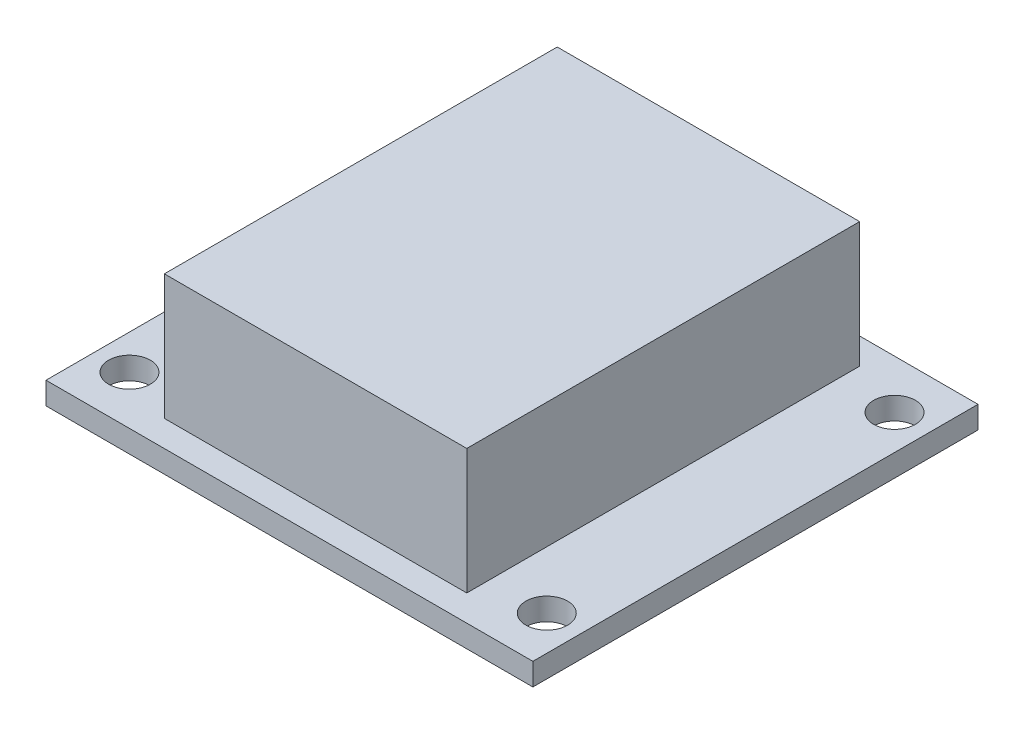
ISO-10303-21;
HEADER;
FILE_DESCRIPTION(('STEP AP214'),'2;1');
FILE_NAME('part.step','',(''),(''),'','','');
FILE_SCHEMA(('AUTOMOTIVE_DESIGN { 1 0 10303 214 1 1 1 1 }'));
ENDSEC;
DATA;
#1=APPLICATION_CONTEXT('core data for automotive mechanical design processes');
#2=APPLICATION_PROTOCOL_DEFINITION('international standard','automotive_design',2000,#1);
#3=PRODUCT_CONTEXT('',#1,'mechanical');
#4=PRODUCT('Part','Part','',(#3));
#5=PRODUCT_RELATED_PRODUCT_CATEGORY('part','',(#4));
#6=PRODUCT_DEFINITION_FORMATION('','',#4);
#7=PRODUCT_DEFINITION_CONTEXT('part definition',#1,'design');
#8=PRODUCT_DEFINITION('design','',#6,#7);
#9=PRODUCT_DEFINITION_SHAPE('','',#8);
#10=(LENGTH_UNIT() NAMED_UNIT(*) SI_UNIT(.MILLI.,.METRE.));
#11=(NAMED_UNIT(*) PLANE_ANGLE_UNIT() SI_UNIT($,.RADIAN.));
#12=(NAMED_UNIT(*) SI_UNIT($,.STERADIAN.) SOLID_ANGLE_UNIT());
#13=UNCERTAINTY_MEASURE_WITH_UNIT(LENGTH_MEASURE(1.E-05),#10,'distance_accuracy_value','');
#14=(GEOMETRIC_REPRESENTATION_CONTEXT(3) GLOBAL_UNCERTAINTY_ASSIGNED_CONTEXT((#13)) GLOBAL_UNIT_ASSIGNED_CONTEXT((#10,
#11,#12)) REPRESENTATION_CONTEXT('',''));
#15=CARTESIAN_POINT('',(0.,0.,0.));
#16=DIRECTION('',(0.,0.,1.));
#17=DIRECTION('',(1.,0.,0.));
#18=AXIS2_PLACEMENT_3D('',#15,#16,#17);
#19=CARTESIAN_POINT('',(0.,1.6,0.));
#20=DIRECTION('',(0.,-1.,0.));
#21=DIRECTION('',(0.,0.,-1.));
#22=AXIS2_PLACEMENT_3D('',#19,#20,#21);
#23=PLANE('',#22);
#24=CARTESIAN_POINT('',(-15.,1.6,12.5));
#25=DIRECTION('',(0.,1.,0.));
#26=DIRECTION('',(0.,0.,-1.));
#27=AXIS2_PLACEMENT_3D('',#24,#25,#26);
#28=CIRCLE('',#27,1.5);
#29=CARTESIAN_POINT('',(-15.,1.6,11.));
#30=VERTEX_POINT('',#29);
#31=EDGE_CURVE('E122',#30,#30,#28,.T.);
#32=ORIENTED_EDGE('',*,*,#31,.F.);
#33=EDGE_LOOP('',(#32));
#34=FACE_BOUND('',#33,.T.);
#35=CARTESIAN_POINT('',(15.,1.6,-12.5));
#36=DIRECTION('',(0.,1.,0.));
#37=DIRECTION('',(0.,0.,-1.));
#38=AXIS2_PLACEMENT_3D('',#35,#36,#37);
#39=CIRCLE('',#38,1.5);
#40=CARTESIAN_POINT('',(15.,1.6,-14.));
#41=VERTEX_POINT('',#40);
#42=EDGE_CURVE('E137',#41,#41,#39,.T.);
#43=ORIENTED_EDGE('',*,*,#42,.F.);
#44=EDGE_LOOP('',(#43));
#45=FACE_BOUND('',#44,.T.);
#46=DIRECTION('',(0.,0.,-1.));
#47=VECTOR('',#46,1.);
#48=CARTESIAN_POINT('',(17.5,1.6,16.));
#49=LINE('',#48,#47);
#50=CARTESIAN_POINT('',(17.5,1.6,16.));
#51=VERTEX_POINT('',#50);
#52=CARTESIAN_POINT('',(17.5,1.6,-16.));
#53=VERTEX_POINT('',#52);
#54=EDGE_CURVE('E149',#51,#53,#49,.T.);
#55=ORIENTED_EDGE('',*,*,#54,.T.);
#56=DIRECTION('',(-1.,0.,0.));
#57=VECTOR('',#56,1.);
#58=CARTESIAN_POINT('',(-17.5,1.6,-16.));
#59=LINE('',#58,#57);
#60=CARTESIAN_POINT('',(-17.5,1.6,-16.));
#61=VERTEX_POINT('',#60);
#62=EDGE_CURVE('E152',#53,#61,#59,.T.);
#63=ORIENTED_EDGE('',*,*,#62,.T.);
#64=DIRECTION('',(0.,0.,1.));
#65=VECTOR('',#64,1.);
#66=CARTESIAN_POINT('',(-17.5,1.6,16.));
#67=LINE('',#66,#65);
#68=CARTESIAN_POINT('',(-17.5,1.6,16.));
#69=VERTEX_POINT('',#68);
#70=EDGE_CURVE('E155',#61,#69,#67,.T.);
#71=ORIENTED_EDGE('',*,*,#70,.T.);
#72=DIRECTION('',(1.,0.,0.));
#73=VECTOR('',#72,1.);
#74=CARTESIAN_POINT('',(-17.5,1.6,16.));
#75=LINE('',#74,#73);
#76=EDGE_CURVE('E157',#69,#51,#75,.T.);
#77=ORIENTED_EDGE('',*,*,#76,.T.);
#78=EDGE_LOOP('',(#55,#63,#71,#77));
#79=FACE_BOUND('',#78,.T.);
#80=CARTESIAN_POINT('',(-15.,1.6,-12.5));
#81=DIRECTION('',(0.,1.,0.));
#82=DIRECTION('',(0.,0.,1.));
#83=AXIS2_PLACEMENT_3D('',#80,#81,#82);
#84=CIRCLE('',#83,1.5);
#85=CARTESIAN_POINT('',(-15.,1.6,-11.));
#86=VERTEX_POINT('',#85);
#87=EDGE_CURVE('E143',#86,#86,#84,.T.);
#88=ORIENTED_EDGE('',*,*,#87,.F.);
#89=EDGE_LOOP('',(#88));
#90=FACE_BOUND('',#89,.T.);
#91=CARTESIAN_POINT('',(15.,1.6,12.5));
#92=DIRECTION('',(0.,1.,0.));
#93=DIRECTION('',(0.,0.,1.));
#94=AXIS2_PLACEMENT_3D('',#91,#92,#93);
#95=CIRCLE('',#94,1.5);
#96=CARTESIAN_POINT('',(15.,1.6,14.));
#97=VERTEX_POINT('',#96);
#98=EDGE_CURVE('E131',#97,#97,#95,.T.);
#99=ORIENTED_EDGE('',*,*,#98,.F.);
#100=EDGE_LOOP('',(#99));
#101=FACE_BOUND('',#100,.T.);
#102=DIRECTION('',(0.,0.,-1.));
#103=VECTOR('',#102,1.);
#104=CARTESIAN_POINT('',(10.8703788030198,1.6,14.12185100952));
#105=LINE('',#104,#103);
#106=CARTESIAN_POINT('',(10.8703788030198,1.6,14.12185100952));
#107=VERTEX_POINT('',#106);
#108=CARTESIAN_POINT('',(10.8703788030198,1.6,-14.12185100952));
#109=VERTEX_POINT('',#108);
#110=EDGE_CURVE('E118',#107,#109,#105,.T.);
#111=ORIENTED_EDGE('',*,*,#110,.F.);
#112=DIRECTION('',(1.,0.,0.));
#113=VECTOR('',#112,1.);
#114=CARTESIAN_POINT('',(-10.8703788030198,1.6,14.12185100952));
#115=LINE('',#114,#113);
#116=CARTESIAN_POINT('',(-10.8703788030198,1.6,14.12185100952));
#117=VERTEX_POINT('',#116);
#118=EDGE_CURVE('E115',#117,#107,#115,.T.);
#119=ORIENTED_EDGE('',*,*,#118,.F.);
#120=DIRECTION('',(0.,0.,1.));
#121=VECTOR('',#120,1.);
#122=CARTESIAN_POINT('',(-10.8703788030198,1.6,14.12185100952));
#123=LINE('',#122,#121);
#124=CARTESIAN_POINT('',(-10.8703788030198,1.6,-14.12185100952));
#125=VERTEX_POINT('',#124);
#126=EDGE_CURVE('E53',#125,#117,#123,.T.);
#127=ORIENTED_EDGE('',*,*,#126,.F.);
#128=DIRECTION('',(-1.,0.,0.));
#129=VECTOR('',#128,1.);
#130=CARTESIAN_POINT('',(-10.8703788030198,1.6,-14.12185100952));
#131=LINE('',#130,#129);
#132=EDGE_CURVE('E48',#109,#125,#131,.T.);
#133=ORIENTED_EDGE('',*,*,#132,.F.);
#134=EDGE_LOOP('',(#111,#119,#127,#133));
#135=FACE_BOUND('',#134,.T.);
#136=ADVANCED_FACE('F33',(#34,#45,#79,#90,#101,#135),#23,.F.);
#137=CARTESIAN_POINT('',(0.,0.,0.));
#138=DIRECTION('',(0.,-1.,0.));
#139=DIRECTION('',(0.,0.,-1.));
#140=AXIS2_PLACEMENT_3D('',#137,#138,#139);
#141=PLANE('',#140);
#142=CARTESIAN_POINT('',(15.,0.,12.5));
#143=DIRECTION('',(0.,1.,0.));
#144=DIRECTION('',(0.,0.,1.));
#145=AXIS2_PLACEMENT_3D('',#142,#143,#144);
#146=CIRCLE('',#145,1.5);
#147=CARTESIAN_POINT('',(15.,0.,14.));
#148=VERTEX_POINT('',#147);
#149=EDGE_CURVE('E129',#148,#148,#146,.T.);
#150=ORIENTED_EDGE('',*,*,#149,.T.);
#151=EDGE_LOOP('',(#150));
#152=FACE_BOUND('',#151,.T.);
#153=CARTESIAN_POINT('',(-15.,0.,-12.5));
#154=DIRECTION('',(0.,1.,0.));
#155=DIRECTION('',(0.,0.,1.));
#156=AXIS2_PLACEMENT_3D('',#153,#154,#155);
#157=CIRCLE('',#156,1.5);
#158=CARTESIAN_POINT('',(-15.,0.,-11.));
#159=VERTEX_POINT('',#158);
#160=EDGE_CURVE('E140',#159,#159,#157,.T.);
#161=ORIENTED_EDGE('',*,*,#160,.T.);
#162=EDGE_LOOP('',(#161));
#163=FACE_BOUND('',#162,.T.);
#164=DIRECTION('',(0.,0.,-1.));
#165=VECTOR('',#164,1.);
#166=CARTESIAN_POINT('',(17.5,0.,16.));
#167=LINE('',#166,#165);
#168=CARTESIAN_POINT('',(17.5,0.,16.));
#169=VERTEX_POINT('',#168);
#170=CARTESIAN_POINT('',(17.5,0.,-16.));
#171=VERTEX_POINT('',#170);
#172=EDGE_CURVE('E146',#169,#171,#167,.T.);
#173=ORIENTED_EDGE('',*,*,#172,.F.);
#174=DIRECTION('',(1.,0.,0.));
#175=VECTOR('',#174,1.);
#176=CARTESIAN_POINT('',(-17.5,0.,16.));
#177=LINE('',#176,#175);
#178=CARTESIAN_POINT('',(-17.5,0.,16.));
#179=VERTEX_POINT('',#178);
#180=EDGE_CURVE('E153',#179,#169,#177,.T.);
#181=ORIENTED_EDGE('',*,*,#180,.F.);
#182=DIRECTION('',(0.,0.,1.));
#183=VECTOR('',#182,1.);
#184=CARTESIAN_POINT('',(-17.5,0.,16.));
#185=LINE('',#184,#183);
#186=CARTESIAN_POINT('',(-17.5,0.,-16.));
#187=VERTEX_POINT('',#186);
#188=EDGE_CURVE('E164',#187,#179,#185,.T.);
#189=ORIENTED_EDGE('',*,*,#188,.F.);
#190=DIRECTION('',(-1.,0.,0.));
#191=VECTOR('',#190,1.);
#192=CARTESIAN_POINT('',(-17.5,0.,-16.));
#193=LINE('',#192,#191);
#194=EDGE_CURVE('E162',#171,#187,#193,.T.);
#195=ORIENTED_EDGE('',*,*,#194,.F.);
#196=EDGE_LOOP('',(#173,#181,#189,#195));
#197=FACE_BOUND('',#196,.T.);
#198=CARTESIAN_POINT('',(15.,0.,-12.5));
#199=DIRECTION('',(0.,1.,0.));
#200=DIRECTION('',(0.,0.,-1.));
#201=AXIS2_PLACEMENT_3D('',#198,#199,#200);
#202=CIRCLE('',#201,1.5);
#203=CARTESIAN_POINT('',(15.,0.,-14.));
#204=VERTEX_POINT('',#203);
#205=EDGE_CURVE('E134',#204,#204,#202,.T.);
#206=ORIENTED_EDGE('',*,*,#205,.T.);
#207=EDGE_LOOP('',(#206));
#208=FACE_BOUND('',#207,.T.);
#209=CARTESIAN_POINT('',(-15.,0.,12.5));
#210=DIRECTION('',(0.,1.,0.));
#211=DIRECTION('',(0.,0.,-1.));
#212=AXIS2_PLACEMENT_3D('',#209,#210,#211);
#213=CIRCLE('',#212,1.5);
#214=CARTESIAN_POINT('',(-15.,0.,11.));
#215=VERTEX_POINT('',#214);
#216=EDGE_CURVE('E119',#215,#215,#213,.T.);
#217=ORIENTED_EDGE('',*,*,#216,.T.);
#218=EDGE_LOOP('',(#217));
#219=FACE_BOUND('',#218,.T.);
#220=ADVANCED_FACE('F182',(#152,#163,#197,#208,#219),#141,.T.);
#221=CARTESIAN_POINT('',(17.5,1.6,16.));
#222=DIRECTION('',(-1.,0.,0.));
#223=DIRECTION('',(0.,0.,1.));
#224=AXIS2_PLACEMENT_3D('',#221,#222,#223);
#225=PLANE('',#224);
#226=ORIENTED_EDGE('',*,*,#172,.T.);
#227=DIRECTION('',(0.,-1.,0.));
#228=VECTOR('',#227,1.);
#229=CARTESIAN_POINT('',(17.5,1.6,-16.));
#230=LINE('',#229,#228);
#231=EDGE_CURVE('E11',#53,#171,#230,.T.);
#232=ORIENTED_EDGE('',*,*,#231,.F.);
#233=ORIENTED_EDGE('',*,*,#54,.F.);
#234=DIRECTION('',(0.,-1.,0.));
#235=VECTOR('',#234,1.);
#236=CARTESIAN_POINT('',(17.5,1.6,16.));
#237=LINE('',#236,#235);
#238=EDGE_CURVE('E159',#51,#169,#237,.T.);
#239=ORIENTED_EDGE('',*,*,#238,.T.);
#240=EDGE_LOOP('',(#226,#232,#233,#239));
#241=FACE_BOUND('',#240,.T.);
#242=ADVANCED_FACE('F35',(#241),#225,.F.);
#243=CARTESIAN_POINT('',(-17.5,1.6,-16.));
#244=DIRECTION('',(0.,0.,1.));
#245=DIRECTION('',(1.,0.,0.));
#246=AXIS2_PLACEMENT_3D('',#243,#244,#245);
#247=PLANE('',#246);
#248=ORIENTED_EDGE('',*,*,#194,.T.);
#249=DIRECTION('',(0.,-1.,0.));
#250=VECTOR('',#249,1.);
#251=CARTESIAN_POINT('',(-17.5,1.6,-16.));
#252=LINE('',#251,#250);
#253=EDGE_CURVE('E41',#61,#187,#252,.T.);
#254=ORIENTED_EDGE('',*,*,#253,.F.);
#255=ORIENTED_EDGE('',*,*,#62,.F.);
#256=ORIENTED_EDGE('',*,*,#231,.T.);
#257=EDGE_LOOP('',(#248,#254,#255,#256));
#258=FACE_BOUND('',#257,.T.);
#259=ADVANCED_FACE('F193',(#258),#247,.F.);
#260=CARTESIAN_POINT('',(-17.5,1.6,16.));
#261=DIRECTION('',(1.,0.,0.));
#262=DIRECTION('',(0.,0.,-1.));
#263=AXIS2_PLACEMENT_3D('',#260,#261,#262);
#264=PLANE('',#263);
#265=ORIENTED_EDGE('',*,*,#188,.T.);
#266=DIRECTION('',(0.,-1.,0.));
#267=VECTOR('',#266,1.);
#268=CARTESIAN_POINT('',(-17.5,1.6,16.));
#269=LINE('',#268,#267);
#270=EDGE_CURVE('E169',#69,#179,#269,.T.);
#271=ORIENTED_EDGE('',*,*,#270,.F.);
#272=ORIENTED_EDGE('',*,*,#70,.F.);
#273=ORIENTED_EDGE('',*,*,#253,.T.);
#274=EDGE_LOOP('',(#265,#271,#272,#273));
#275=FACE_BOUND('',#274,.T.);
#276=ADVANCED_FACE('F176',(#275),#264,.F.);
#277=CARTESIAN_POINT('',(-17.5,1.6,16.));
#278=DIRECTION('',(0.,0.,-1.));
#279=DIRECTION('',(-1.,0.,0.));
#280=AXIS2_PLACEMENT_3D('',#277,#278,#279);
#281=PLANE('',#280);
#282=ORIENTED_EDGE('',*,*,#180,.T.);
#283=ORIENTED_EDGE('',*,*,#238,.F.);
#284=ORIENTED_EDGE('',*,*,#76,.F.);
#285=ORIENTED_EDGE('',*,*,#270,.T.);
#286=EDGE_LOOP('',(#282,#283,#284,#285));
#287=FACE_BOUND('',#286,.T.);
#288=ADVANCED_FACE('F186',(#287),#281,.F.);
#289=CARTESIAN_POINT('',(-15.,1.6,-12.5));
#290=DIRECTION('',(0.,-1.,0.));
#291=DIRECTION('',(0.,0.,-1.));
#292=AXIS2_PLACEMENT_3D('',#289,#290,#291);
#293=CYLINDRICAL_SURFACE('',#292,1.5);
#294=ORIENTED_EDGE('',*,*,#87,.T.);
#295=EDGE_LOOP('',(#294));
#296=FACE_BOUND('',#295,.T.);
#297=ORIENTED_EDGE('',*,*,#160,.F.);
#298=EDGE_LOOP('',(#297));
#299=FACE_BOUND('',#298,.T.);
#300=ADVANCED_FACE('F211',(#296,#299),#293,.F.);
#301=CARTESIAN_POINT('',(15.,1.6,-12.5));
#302=DIRECTION('',(0.,-1.,0.));
#303=DIRECTION('',(0.,0.,-1.));
#304=AXIS2_PLACEMENT_3D('',#301,#302,#303);
#305=CYLINDRICAL_SURFACE('',#304,1.5);
#306=ORIENTED_EDGE('',*,*,#42,.T.);
#307=EDGE_LOOP('',(#306));
#308=FACE_BOUND('',#307,.T.);
#309=ORIENTED_EDGE('',*,*,#205,.F.);
#310=EDGE_LOOP('',(#309));
#311=FACE_BOUND('',#310,.T.);
#312=ADVANCED_FACE('F218',(#308,#311),#305,.F.);
#313=CARTESIAN_POINT('',(15.,1.6,12.5));
#314=DIRECTION('',(0.,-1.,0.));
#315=DIRECTION('',(0.,0.,-1.));
#316=AXIS2_PLACEMENT_3D('',#313,#314,#315);
#317=CYLINDRICAL_SURFACE('',#316,1.5);
#318=ORIENTED_EDGE('',*,*,#98,.T.);
#319=EDGE_LOOP('',(#318));
#320=FACE_BOUND('',#319,.T.);
#321=ORIENTED_EDGE('',*,*,#149,.F.);
#322=EDGE_LOOP('',(#321));
#323=FACE_BOUND('',#322,.T.);
#324=ADVANCED_FACE('F223',(#320,#323),#317,.F.);
#325=CARTESIAN_POINT('',(-15.,1.6,12.5));
#326=DIRECTION('',(0.,-1.,0.));
#327=DIRECTION('',(0.,0.,-1.));
#328=AXIS2_PLACEMENT_3D('',#325,#326,#327);
#329=CYLINDRICAL_SURFACE('',#328,1.5);
#330=ORIENTED_EDGE('',*,*,#31,.T.);
#331=EDGE_LOOP('',(#330));
#332=FACE_BOUND('',#331,.T.);
#333=ORIENTED_EDGE('',*,*,#216,.F.);
#334=EDGE_LOOP('',(#333));
#335=FACE_BOUND('',#334,.T.);
#336=ADVANCED_FACE('F258',(#332,#335),#329,.F.);
#337=CARTESIAN_POINT('',(10.8703788030198,10.6,14.12185100952));
#338=DIRECTION('',(-1.,0.,0.));
#339=DIRECTION('',(0.,0.,1.));
#340=AXIS2_PLACEMENT_3D('',#337,#338,#339);
#341=PLANE('',#340);
#342=ORIENTED_EDGE('',*,*,#110,.T.);
#343=DIRECTION('',(0.,-1.,0.));
#344=VECTOR('',#343,1.);
#345=CARTESIAN_POINT('',(10.8703788030198,10.6,-14.12185100952));
#346=LINE('',#345,#344);
#347=CARTESIAN_POINT('',(10.8703788030198,10.6,-14.12185100952));
#348=VERTEX_POINT('',#347);
#349=EDGE_CURVE('E99',#348,#109,#346,.T.);
#350=ORIENTED_EDGE('',*,*,#349,.F.);
#351=DIRECTION('',(0.,0.,-1.));
#352=VECTOR('',#351,1.);
#353=CARTESIAN_POINT('',(10.8703788030198,10.6,14.12185100952));
#354=LINE('',#353,#352);
#355=CARTESIAN_POINT('',(10.8703788030198,10.6,14.12185100952));
#356=VERTEX_POINT('',#355);
#357=EDGE_CURVE('E106',#356,#348,#354,.T.);
#358=ORIENTED_EDGE('',*,*,#357,.F.);
#359=DIRECTION('',(0.,-1.,0.));
#360=VECTOR('',#359,1.);
#361=CARTESIAN_POINT('',(10.8703788030198,10.6,14.12185100952));
#362=LINE('',#361,#360);
#363=EDGE_CURVE('E236',#356,#107,#362,.T.);
#364=ORIENTED_EDGE('',*,*,#363,.T.);
#365=EDGE_LOOP('',(#342,#350,#358,#364));
#366=FACE_BOUND('',#365,.T.);
#367=ADVANCED_FACE('F117',(#366),#341,.F.);
#368=CARTESIAN_POINT('',(-10.8703788030198,10.6,-14.12185100952));
#369=DIRECTION('',(0.,0.,1.));
#370=DIRECTION('',(1.,0.,0.));
#371=AXIS2_PLACEMENT_3D('',#368,#369,#370);
#372=PLANE('',#371);
#373=ORIENTED_EDGE('',*,*,#132,.T.);
#374=DIRECTION('',(0.,-1.,0.));
#375=VECTOR('',#374,1.);
#376=CARTESIAN_POINT('',(-10.8703788030198,10.6,-14.12185100952));
#377=LINE('',#376,#375);
#378=CARTESIAN_POINT('',(-10.8703788030198,10.6,-14.12185100952));
#379=VERTEX_POINT('',#378);
#380=EDGE_CURVE('E102',#379,#125,#377,.T.);
#381=ORIENTED_EDGE('',*,*,#380,.F.);
#382=DIRECTION('',(-1.,0.,0.));
#383=VECTOR('',#382,1.);
#384=CARTESIAN_POINT('',(-10.8703788030198,10.6,-14.12185100952));
#385=LINE('',#384,#383);
#386=EDGE_CURVE('E95',#348,#379,#385,.T.);
#387=ORIENTED_EDGE('',*,*,#386,.F.);
#388=ORIENTED_EDGE('',*,*,#349,.T.);
#389=EDGE_LOOP('',(#373,#381,#387,#388));
#390=FACE_BOUND('',#389,.T.);
#391=ADVANCED_FACE('F97',(#390),#372,.F.);
#392=CARTESIAN_POINT('',(-10.8703788030198,10.6,14.12185100952));
#393=DIRECTION('',(1.,0.,0.));
#394=DIRECTION('',(0.,0.,-1.));
#395=AXIS2_PLACEMENT_3D('',#392,#393,#394);
#396=PLANE('',#395);
#397=ORIENTED_EDGE('',*,*,#126,.T.);
#398=DIRECTION('',(0.,-1.,0.));
#399=VECTOR('',#398,1.);
#400=CARTESIAN_POINT('',(-10.8703788030198,10.6,14.12185100952));
#401=LINE('',#400,#399);
#402=CARTESIAN_POINT('',(-10.8703788030198,10.6,14.12185100952));
#403=VERTEX_POINT('',#402);
#404=EDGE_CURVE('E124',#403,#117,#401,.T.);
#405=ORIENTED_EDGE('',*,*,#404,.F.);
#406=DIRECTION('',(0.,0.,1.));
#407=VECTOR('',#406,1.);
#408=CARTESIAN_POINT('',(-10.8703788030198,10.6,14.12185100952));
#409=LINE('',#408,#407);
#410=EDGE_CURVE('E105',#379,#403,#409,.T.);
#411=ORIENTED_EDGE('',*,*,#410,.F.);
#412=ORIENTED_EDGE('',*,*,#380,.T.);
#413=EDGE_LOOP('',(#397,#405,#411,#412));
#414=FACE_BOUND('',#413,.T.);
#415=ADVANCED_FACE('F245',(#414),#396,.F.);
#416=CARTESIAN_POINT('',(-10.8703788030198,10.6,14.12185100952));
#417=DIRECTION('',(0.,0.,-1.));
#418=DIRECTION('',(-1.,0.,0.));
#419=AXIS2_PLACEMENT_3D('',#416,#417,#418);
#420=PLANE('',#419);
#421=ORIENTED_EDGE('',*,*,#118,.T.);
#422=ORIENTED_EDGE('',*,*,#363,.F.);
#423=DIRECTION('',(1.,0.,0.));
#424=VECTOR('',#423,1.);
#425=CARTESIAN_POINT('',(-10.8703788030198,10.6,14.12185100952));
#426=LINE('',#425,#424);
#427=EDGE_CURVE('E111',#403,#356,#426,.T.);
#428=ORIENTED_EDGE('',*,*,#427,.F.);
#429=ORIENTED_EDGE('',*,*,#404,.T.);
#430=EDGE_LOOP('',(#421,#422,#428,#429));
#431=FACE_BOUND('',#430,.T.);
#432=ADVANCED_FACE('F235',(#431),#420,.F.);
#433=CARTESIAN_POINT('',(0.,10.6,0.));
#434=DIRECTION('',(0.,-1.,0.));
#435=DIRECTION('',(0.,0.,-1.));
#436=AXIS2_PLACEMENT_3D('',#433,#434,#435);
#437=PLANE('',#436);
#438=ORIENTED_EDGE('',*,*,#357,.T.);
#439=ORIENTED_EDGE('',*,*,#386,.T.);
#440=ORIENTED_EDGE('',*,*,#410,.T.);
#441=ORIENTED_EDGE('',*,*,#427,.T.);
#442=EDGE_LOOP('',(#438,#439,#440,#441));
#443=FACE_BOUND('',#442,.T.);
#444=ADVANCED_FACE('F109',(#443),#437,.F.);
#445=CLOSED_SHELL('',(#136,#220,#242,#259,#276,#288,#300,#312,#324,#336,#367,#391,#415,#432,#444));
#446=MANIFOLD_SOLID_BREP('B2',#445);
#447=ADVANCED_BREP_SHAPE_REPRESENTATION('',(#18,#446),#14);
#448=SHAPE_DEFINITION_REPRESENTATION(#9,#447);
ENDSEC;
END-ISO-10303-21;
